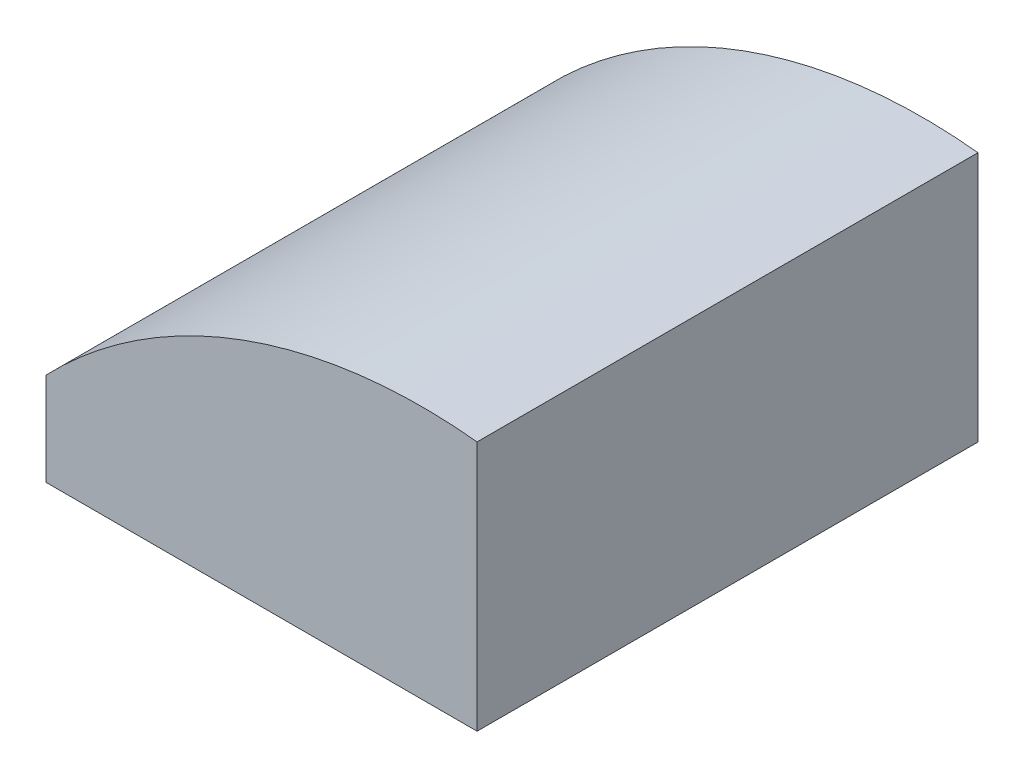
ISO-10303-21;
HEADER;
FILE_DESCRIPTION(('STEP AP214'),'2;1');
FILE_NAME('part.step','',(''),(''),'','','');
FILE_SCHEMA(('AUTOMOTIVE_DESIGN { 1 0 10303 214 1 1 1 1 }'));
ENDSEC;
DATA;
#1=APPLICATION_CONTEXT('core data for automotive mechanical design processes');
#2=APPLICATION_PROTOCOL_DEFINITION('international standard','automotive_design',2000,#1);
#3=PRODUCT_CONTEXT('',#1,'mechanical');
#4=PRODUCT('Part','Part','',(#3));
#5=PRODUCT_RELATED_PRODUCT_CATEGORY('part','',(#4));
#6=PRODUCT_DEFINITION_FORMATION('','',#4);
#7=PRODUCT_DEFINITION_CONTEXT('part definition',#1,'design');
#8=PRODUCT_DEFINITION('design','',#6,#7);
#9=PRODUCT_DEFINITION_SHAPE('','',#8);
#10=(LENGTH_UNIT() NAMED_UNIT(*) SI_UNIT(.MILLI.,.METRE.));
#11=(NAMED_UNIT(*) PLANE_ANGLE_UNIT() SI_UNIT($,.RADIAN.));
#12=(NAMED_UNIT(*) SI_UNIT($,.STERADIAN.) SOLID_ANGLE_UNIT());
#13=UNCERTAINTY_MEASURE_WITH_UNIT(LENGTH_MEASURE(1.E-05),#10,'distance_accuracy_value','');
#14=(GEOMETRIC_REPRESENTATION_CONTEXT(3) GLOBAL_UNCERTAINTY_ASSIGNED_CONTEXT((#13)) GLOBAL_UNIT_ASSIGNED_CONTEXT((#10,
#11,#12)) REPRESENTATION_CONTEXT('',''));
#15=CARTESIAN_POINT('',(0.,0.,0.));
#16=DIRECTION('',(0.,0.,1.));
#17=DIRECTION('',(1.,0.,0.));
#18=AXIS2_PLACEMENT_3D('',#15,#16,#17);
#19=CARTESIAN_POINT('',(43.7181883185697,0.,-50.8));
#20=DIRECTION('',(0.,-1.,0.));
#21=DIRECTION('',(0.,0.,-1.));
#22=AXIS2_PLACEMENT_3D('',#19,#20,#21);
#23=PLANE('',#22);
#24=DIRECTION('',(1.,0.,0.));
#25=VECTOR('',#24,1.);
#26=CARTESIAN_POINT('',(43.7181883185697,0.,0.));
#27=LINE('',#26,#25);
#28=CARTESIAN_POINT('',(0.,0.,0.));
#29=VERTEX_POINT('',#28);
#30=CARTESIAN_POINT('',(43.7181883185697,0.,0.));
#31=VERTEX_POINT('',#30);
#32=EDGE_CURVE('E94',#29,#31,#27,.T.);
#33=ORIENTED_EDGE('',*,*,#32,.F.);
#34=DIRECTION('',(0.,0.,1.));
#35=VECTOR('',#34,1.);
#36=CARTESIAN_POINT('',(0.,0.,-50.8));
#37=LINE('',#36,#35);
#38=CARTESIAN_POINT('',(0.,0.,-50.8));
#39=VERTEX_POINT('',#38);
#40=EDGE_CURVE('E11',#39,#29,#37,.T.);
#41=ORIENTED_EDGE('',*,*,#40,.F.);
#42=DIRECTION('',(1.,0.,0.));
#43=VECTOR('',#42,1.);
#44=CARTESIAN_POINT('',(43.7181883185697,0.,-50.8));
#45=LINE('',#44,#43);
#46=CARTESIAN_POINT('',(43.7181883185697,0.,-50.8));
#47=VERTEX_POINT('',#46);
#48=EDGE_CURVE('E88',#39,#47,#45,.T.);
#49=ORIENTED_EDGE('',*,*,#48,.T.);
#50=DIRECTION('',(0.,0.,1.));
#51=VECTOR('',#50,1.);
#52=CARTESIAN_POINT('',(43.7181883185697,0.,-50.8));
#53=LINE('',#52,#51);
#54=EDGE_CURVE('E33',#47,#31,#53,.T.);
#55=ORIENTED_EDGE('',*,*,#54,.T.);
#56=EDGE_LOOP('',(#33,#41,#49,#55));
#57=FACE_BOUND('',#56,.T.);
#58=ADVANCED_FACE('F30',(#57),#23,.T.);
#59=CARTESIAN_POINT('',(0.,0.,-50.8));
#60=DIRECTION('',(-1.,0.,0.));
#61=DIRECTION('',(0.,0.,1.));
#62=AXIS2_PLACEMENT_3D('',#59,#60,#61);
#63=PLANE('',#62);
#64=DIRECTION('',(0.,-1.,0.));
#65=VECTOR('',#64,1.);
#66=CARTESIAN_POINT('',(0.,0.,0.));
#67=LINE('',#66,#65);
#68=CARTESIAN_POINT('',(0.,9.42016509433963,0.));
#69=VERTEX_POINT('',#68);
#70=EDGE_CURVE('E90',#69,#29,#67,.T.);
#71=ORIENTED_EDGE('',*,*,#70,.F.);
#72=DIRECTION('',(0.,0.,1.));
#73=VECTOR('',#72,1.);
#74=CARTESIAN_POINT('',(0.,9.42016509433963,-50.8));
#75=LINE('',#74,#73);
#76=CARTESIAN_POINT('',(0.,9.42016509433963,-50.8));
#77=VERTEX_POINT('',#76);
#78=EDGE_CURVE('E39',#77,#69,#75,.T.);
#79=ORIENTED_EDGE('',*,*,#78,.F.);
#80=DIRECTION('',(0.,-1.,0.));
#81=VECTOR('',#80,1.);
#82=CARTESIAN_POINT('',(0.,0.,-50.8));
#83=LINE('',#82,#81);
#84=EDGE_CURVE('E85',#77,#39,#83,.T.);
#85=ORIENTED_EDGE('',*,*,#84,.T.);
#86=ORIENTED_EDGE('',*,*,#40,.T.);
#87=EDGE_LOOP('',(#71,#79,#85,#86));
#88=FACE_BOUND('',#87,.T.);
#89=ADVANCED_FACE('F104',(#88),#63,.T.);
#90=CARTESIAN_POINT('',(38.1424743702449,-27.0936046567455,-50.8));
#91=DIRECTION('',(0.,0.,1.));
#92=DIRECTION('',(1.,0.,0.));
#93=AXIS2_PLACEMENT_3D('',#90,#91,#92);
#94=CYLINDRICAL_SURFACE('',#93,52.802497407983);
#95=CARTESIAN_POINT('',(38.1424743702449,-27.0936046567455,0.));
#96=DIRECTION('',(0.,0.,1.));
#97=DIRECTION('',(-1.,0.,0.));
#98=AXIS2_PLACEMENT_3D('',#95,#96,#97);
#99=CIRCLE('',#98,52.802497407983);
#100=CARTESIAN_POINT('',(43.7181883185697,25.413681946987,0.));
#101=VERTEX_POINT('',#100);
#102=EDGE_CURVE('E80',#101,#69,#99,.T.);
#103=ORIENTED_EDGE('',*,*,#102,.F.);
#104=DIRECTION('',(0.,0.,1.));
#105=VECTOR('',#104,1.);
#106=CARTESIAN_POINT('',(43.7181883185697,25.413681946987,-50.8));
#107=LINE('',#106,#105);
#108=CARTESIAN_POINT('',(43.7181883185697,25.413681946987,-50.8));
#109=VERTEX_POINT('',#108);
#110=EDGE_CURVE('E75',#109,#101,#107,.T.);
#111=ORIENTED_EDGE('',*,*,#110,.F.);
#112=CARTESIAN_POINT('',(38.1424743702449,-27.0936046567455,-50.8));
#113=DIRECTION('',(0.,0.,1.));
#114=DIRECTION('',(-1.,0.,0.));
#115=AXIS2_PLACEMENT_3D('',#112,#113,#114);
#116=CIRCLE('',#115,52.802497407983);
#117=EDGE_CURVE('E78',#109,#77,#116,.T.);
#118=ORIENTED_EDGE('',*,*,#117,.T.);
#119=ORIENTED_EDGE('',*,*,#78,.T.);
#120=EDGE_LOOP('',(#103,#111,#118,#119));
#121=FACE_BOUND('',#120,.T.);
#122=ADVANCED_FACE('F77',(#121),#94,.T.);
#123=CARTESIAN_POINT('',(43.7181883185697,25.413681946987,-50.8));
#124=DIRECTION('',(1.,0.,0.));
#125=DIRECTION('',(0.,0.,-1.));
#126=AXIS2_PLACEMENT_3D('',#123,#124,#125);
#127=PLANE('',#126);
#128=DIRECTION('',(0.,1.,0.));
#129=VECTOR('',#128,1.);
#130=CARTESIAN_POINT('',(43.7181883185697,25.413681946987,0.));
#131=LINE('',#130,#129);
#132=EDGE_CURVE('E97',#31,#101,#131,.T.);
#133=ORIENTED_EDGE('',*,*,#132,.F.);
#134=ORIENTED_EDGE('',*,*,#54,.F.);
#135=DIRECTION('',(0.,1.,0.));
#136=VECTOR('',#135,1.);
#137=CARTESIAN_POINT('',(43.7181883185697,25.413681946987,-50.8));
#138=LINE('',#137,#136);
#139=EDGE_CURVE('E84',#47,#109,#138,.T.);
#140=ORIENTED_EDGE('',*,*,#139,.T.);
#141=ORIENTED_EDGE('',*,*,#110,.T.);
#142=EDGE_LOOP('',(#133,#134,#140,#141));
#143=FACE_BOUND('',#142,.T.);
#144=ADVANCED_FACE('F87',(#143),#127,.T.);
#145=CARTESIAN_POINT('',(38.1424743702449,-27.0936046567455,-50.8));
#146=DIRECTION('',(0.,0.,-1.));
#147=DIRECTION('',(-1.,0.,0.));
#148=AXIS2_PLACEMENT_3D('',#145,#146,#147);
#149=PLANE('',#148);
#150=ORIENTED_EDGE('',*,*,#48,.F.);
#151=ORIENTED_EDGE('',*,*,#84,.F.);
#152=ORIENTED_EDGE('',*,*,#117,.F.);
#153=ORIENTED_EDGE('',*,*,#139,.F.);
#154=EDGE_LOOP('',(#150,#151,#152,#153));
#155=FACE_BOUND('',#154,.T.);
#156=ADVANCED_FACE('F83',(#155),#149,.T.);
#157=CARTESIAN_POINT('',(38.1424743702449,-27.0936046567455,0.));
#158=DIRECTION('',(0.,0.,-1.));
#159=DIRECTION('',(-1.,0.,0.));
#160=AXIS2_PLACEMENT_3D('',#157,#158,#159);
#161=PLANE('',#160);
#162=ORIENTED_EDGE('',*,*,#32,.T.);
#163=ORIENTED_EDGE('',*,*,#132,.T.);
#164=ORIENTED_EDGE('',*,*,#102,.T.);
#165=ORIENTED_EDGE('',*,*,#70,.T.);
#166=EDGE_LOOP('',(#162,#163,#164,#165));
#167=FACE_BOUND('',#166,.T.);
#168=ADVANCED_FACE('F103',(#167),#161,.F.);
#169=CLOSED_SHELL('',(#58,#89,#122,#144,#156,#168));
#170=MANIFOLD_SOLID_BREP('B2',#169);
#171=ADVANCED_BREP_SHAPE_REPRESENTATION('',(#18,#170),#14);
#172=SHAPE_DEFINITION_REPRESENTATION(#9,#171);
ENDSEC;
END-ISO-10303-21;
